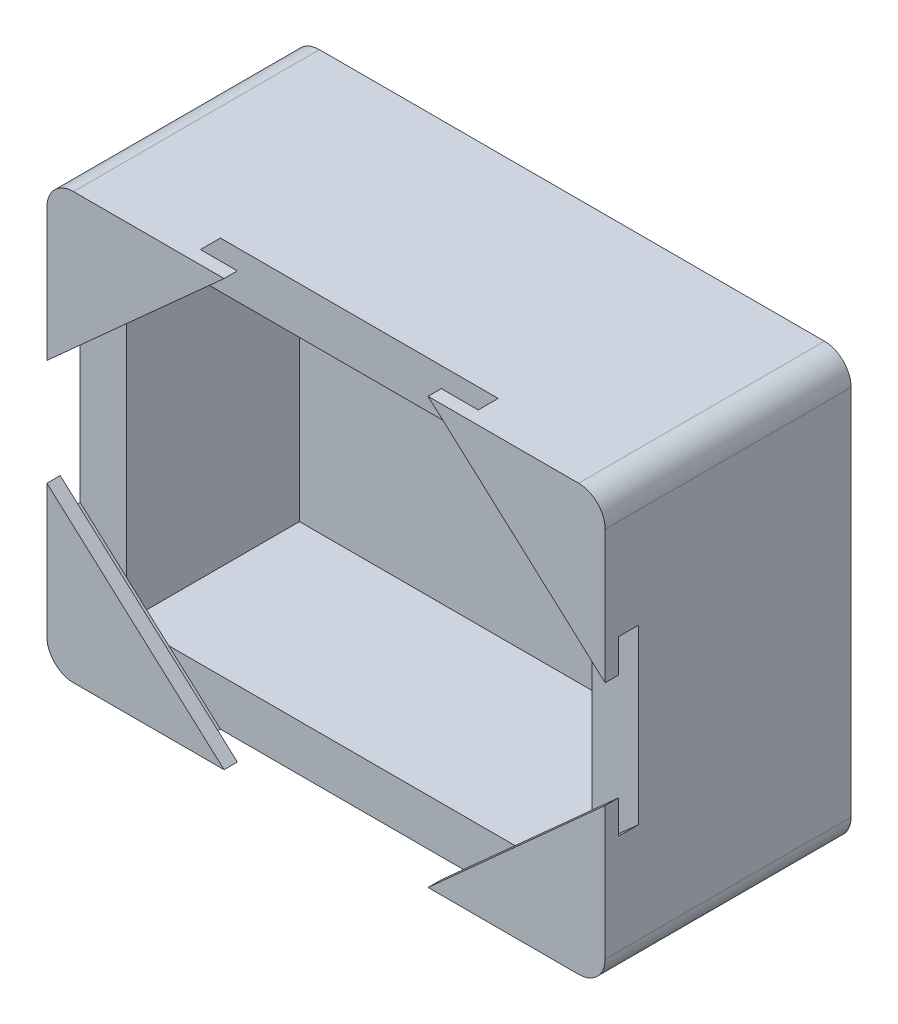
ISO-10303-21;
HEADER;
FILE_DESCRIPTION(('STEP AP214'),'2;1');
FILE_NAME('part.step','',(''),(''),'','','');
FILE_SCHEMA(('AUTOMOTIVE_DESIGN { 1 0 10303 214 1 1 1 1 }'));
ENDSEC;
DATA;
#1=APPLICATION_CONTEXT('core data for automotive mechanical design processes');
#2=APPLICATION_PROTOCOL_DEFINITION('international standard','automotive_design',2000,#1);
#3=PRODUCT_CONTEXT('',#1,'mechanical');
#4=PRODUCT('Part','Part','',(#3));
#5=PRODUCT_RELATED_PRODUCT_CATEGORY('part','',(#4));
#6=PRODUCT_DEFINITION_FORMATION('','',#4);
#7=PRODUCT_DEFINITION_CONTEXT('part definition',#1,'design');
#8=PRODUCT_DEFINITION('design','',#6,#7);
#9=PRODUCT_DEFINITION_SHAPE('','',#8);
#10=(LENGTH_UNIT() NAMED_UNIT(*) SI_UNIT(.MILLI.,.METRE.));
#11=(NAMED_UNIT(*) PLANE_ANGLE_UNIT() SI_UNIT($,.RADIAN.));
#12=(NAMED_UNIT(*) SI_UNIT($,.STERADIAN.) SOLID_ANGLE_UNIT());
#13=UNCERTAINTY_MEASURE_WITH_UNIT(LENGTH_MEASURE(1.E-05),#10,'distance_accuracy_value','');
#14=(GEOMETRIC_REPRESENTATION_CONTEXT(3) GLOBAL_UNCERTAINTY_ASSIGNED_CONTEXT((#13)) GLOBAL_UNIT_ASSIGNED_CONTEXT((#10,
#11,#12)) REPRESENTATION_CONTEXT('',''));
#15=CARTESIAN_POINT('',(0.,0.,0.));
#16=DIRECTION('',(0.,0.,1.));
#17=DIRECTION('',(1.,0.,0.));
#18=AXIS2_PLACEMENT_3D('',#15,#16,#17);
#19=CARTESIAN_POINT('',(2.1,0.650000000000005,1.65));
#20=DIRECTION('',(0.669130606358858,0.743144825477395,0.));
#21=DIRECTION('',(-0.743144825477395,0.669130606358858,0.));
#22=AXIS2_PLACEMENT_3D('',#19,#20,#21);
#23=PLANE('',#22);
#24=DIRECTION('',(0.,0.,-1.));
#25=VECTOR('',#24,1.);
#26=CARTESIAN_POINT('',(2.1,0.650000000000005,0.05));
#27=LINE('',#26,#25);
#28=CARTESIAN_POINT('',(2.1,0.650000000000005,1.8));
#29=VERTEX_POINT('',#28);
#30=CARTESIAN_POINT('',(2.1,0.650000000000005,1.65));
#31=VERTEX_POINT('',#30);
#32=EDGE_CURVE('E100',#29,#31,#27,.T.);
#33=ORIENTED_EDGE('',*,*,#32,.F.);
#34=DIRECTION('',(-0.743144825477395,0.669130606358858,0.));
#35=VECTOR('',#34,1.);
#36=CARTESIAN_POINT('',(2.1,0.650000000000005,1.8));
#37=LINE('',#36,#35);
#38=CARTESIAN_POINT('',(1.04491811091227,1.6,1.8));
#39=VERTEX_POINT('',#38);
#40=EDGE_CURVE('E205',#29,#39,#37,.T.);
#41=ORIENTED_EDGE('',*,*,#40,.T.);
#42=DIRECTION('',(0.,0.,1.));
#43=VECTOR('',#42,1.);
#44=CARTESIAN_POINT('',(1.04491811091227,1.6,0.05));
#45=LINE('',#44,#43);
#46=CARTESIAN_POINT('',(1.04491811091227,1.6,1.65));
#47=VERTEX_POINT('',#46);
#48=EDGE_CURVE('E211',#47,#39,#45,.T.);
#49=ORIENTED_EDGE('',*,*,#48,.F.);
#50=DIRECTION('',(-0.743144825477397,0.669130606358855,0.));
#51=VECTOR('',#50,1.);
#52=CARTESIAN_POINT('',(1.43363249110249,1.25,1.65));
#53=LINE('',#52,#51);
#54=CARTESIAN_POINT('',(1.43363249110249,1.25,1.65));
#55=VERTEX_POINT('',#54);
#56=EDGE_CURVE('E231',#55,#47,#53,.T.);
#57=ORIENTED_EDGE('',*,*,#56,.F.);
#58=DIRECTION('',(0.743144825477392,-0.669130606358861,0.));
#59=VECTOR('',#58,1.);
#60=CARTESIAN_POINT('',(1.43363249110249,1.25,1.65));
#61=LINE('',#60,#59);
#62=CARTESIAN_POINT('',(1.75,0.965141415504248,1.65));
#63=VERTEX_POINT('',#62);
#64=EDGE_CURVE('E247',#55,#63,#61,.T.);
#65=ORIENTED_EDGE('',*,*,#64,.T.);
#66=DIRECTION('',(-0.743144825477396,0.669130606358856,0.));
#67=VECTOR('',#66,1.);
#68=CARTESIAN_POINT('',(2.1,0.650000000000005,1.65));
#69=LINE('',#68,#67);
#70=EDGE_CURVE('E269',#31,#63,#69,.T.);
#71=ORIENTED_EDGE('',*,*,#70,.F.);
#72=EDGE_LOOP('',(#33,#41,#49,#57,#65,#71));
#73=FACE_BOUND('',#72,.T.);
#74=ADVANCED_FACE('F17',(#73),#23,.F.);
#75=CARTESIAN_POINT('',(0.,0.,1.8));
#76=DIRECTION('',(0.,0.,1.));
#77=DIRECTION('',(1.,0.,0.));
#78=AXIS2_PLACEMENT_3D('',#75,#76,#77);
#79=PLANE('',#78);
#80=DIRECTION('',(0.,1.,0.));
#81=VECTOR('',#80,1.);
#82=CARTESIAN_POINT('',(2.1,-1.6,1.8));
#83=LINE('',#82,#81);
#84=CARTESIAN_POINT('',(2.1,0.400000000000003,1.8));
#85=VERTEX_POINT('',#84);
#86=EDGE_CURVE('E286',#85,#29,#83,.T.);
#87=ORIENTED_EDGE('',*,*,#86,.F.);
#88=DIRECTION('',(0.743144825477394,-0.669130606358858,0.));
#89=VECTOR('',#88,1.);
#90=CARTESIAN_POINT('',(0.767264982204967,1.6,1.8));
#91=LINE('',#90,#89);
#92=CARTESIAN_POINT('',(0.767264982204967,1.6,1.8));
#93=VERTEX_POINT('',#92);
#94=EDGE_CURVE('E183',#93,#85,#91,.T.);
#95=ORIENTED_EDGE('',*,*,#94,.F.);
#96=DIRECTION('',(1.,0.,0.));
#97=VECTOR('',#96,1.);
#98=CARTESIAN_POINT('',(2.1,1.6,1.8));
#99=LINE('',#98,#97);
#100=EDGE_CURVE('E199',#39,#93,#99,.F.);
#101=ORIENTED_EDGE('',*,*,#100,.F.);
#102=ORIENTED_EDGE('',*,*,#40,.F.);
#103=EDGE_LOOP('',(#87,#95,#101,#102));
#104=FACE_BOUND('',#103,.T.);
#105=ADVANCED_FACE('F613',(#104),#79,.F.);
#106=CARTESIAN_POINT('',(0.767264982204967,1.6,1.65));
#107=DIRECTION('',(-0.669130606358858,-0.743144825477394,0.));
#108=DIRECTION('',(0.743144825477394,-0.669130606358858,0.));
#109=AXIS2_PLACEMENT_3D('',#106,#107,#108);
#110=PLANE('',#109);
#111=DIRECTION('',(0.743144825477396,-0.669130606358856,0.));
#112=VECTOR('',#111,1.);
#113=CARTESIAN_POINT('',(0.767264982204967,1.6,1.9));
#114=LINE('',#113,#112);
#115=CARTESIAN_POINT('',(0.767264982204967,1.6,1.9));
#116=VERTEX_POINT('',#115);
#117=CARTESIAN_POINT('',(2.1,0.400000000000004,1.9));
#118=VERTEX_POINT('',#117);
#119=EDGE_CURVE('E124',#116,#118,#114,.T.);
#120=ORIENTED_EDGE('',*,*,#119,.F.);
#121=DIRECTION('',(0.,0.,1.));
#122=VECTOR('',#121,1.);
#123=CARTESIAN_POINT('',(0.767264982204967,1.6,0.05));
#124=LINE('',#123,#122);
#125=EDGE_CURVE('E194',#93,#116,#124,.T.);
#126=ORIENTED_EDGE('',*,*,#125,.F.);
#127=ORIENTED_EDGE('',*,*,#94,.T.);
#128=DIRECTION('',(0.,0.,-1.));
#129=VECTOR('',#128,1.);
#130=CARTESIAN_POINT('',(2.1,0.400000000000004,0.05));
#131=LINE('',#130,#129);
#132=EDGE_CURVE('E186',#118,#85,#131,.T.);
#133=ORIENTED_EDGE('',*,*,#132,.F.);
#134=EDGE_LOOP('',(#120,#126,#127,#133));
#135=FACE_BOUND('',#134,.T.);
#136=ADVANCED_FACE('F617',(#135),#110,.T.);
#137=CARTESIAN_POINT('',(1.43363249110248,1.,1.9));
#138=DIRECTION('',(0.,0.,1.));
#139=DIRECTION('',(1.,0.,0.));
#140=AXIS2_PLACEMENT_3D('',#137,#138,#139);
#141=PLANE('',#140);
#142=CARTESIAN_POINT('',(1.9,1.4,1.9));
#143=DIRECTION('',(0.,0.,1.));
#144=DIRECTION('',(1.,0.,0.));
#145=AXIS2_PLACEMENT_3D('',#142,#143,#144);
#146=CIRCLE('',#145,0.2);
#147=CARTESIAN_POINT('',(1.9,1.6,1.9));
#148=VERTEX_POINT('',#147);
#149=CARTESIAN_POINT('',(2.1,1.4,1.9));
#150=VERTEX_POINT('',#149);
#151=EDGE_CURVE('E295',#148,#150,#146,.F.);
#152=ORIENTED_EDGE('',*,*,#151,.F.);
#153=DIRECTION('',(1.,0.,0.));
#154=VECTOR('',#153,1.);
#155=CARTESIAN_POINT('',(2.1,1.6,1.9));
#156=LINE('',#155,#154);
#157=EDGE_CURVE('E198',#116,#148,#156,.T.);
#158=ORIENTED_EDGE('',*,*,#157,.F.);
#159=ORIENTED_EDGE('',*,*,#119,.T.);
#160=DIRECTION('',(0.,1.,0.));
#161=VECTOR('',#160,1.);
#162=CARTESIAN_POINT('',(2.1,-1.6,1.9));
#163=LINE('',#162,#161);
#164=EDGE_CURVE('E191',#150,#118,#163,.F.);
#165=ORIENTED_EDGE('',*,*,#164,.F.);
#166=EDGE_LOOP('',(#152,#158,#159,#165));
#167=FACE_BOUND('',#166,.T.);
#168=ADVANCED_FACE('F620',(#167),#141,.T.);
#169=CARTESIAN_POINT('',(1.43363249110248,-0.999999999999995,1.9));
#170=DIRECTION('',(0.,0.,1.));
#171=DIRECTION('',(1.,0.,0.));
#172=AXIS2_PLACEMENT_3D('',#169,#170,#171);
#173=PLANE('',#172);
#174=CARTESIAN_POINT('',(1.9,-1.4,1.9));
#175=DIRECTION('',(0.,0.,1.));
#176=DIRECTION('',(1.,0.,0.));
#177=AXIS2_PLACEMENT_3D('',#174,#175,#176);
#178=CIRCLE('',#177,0.2);
#179=CARTESIAN_POINT('',(1.9,-1.6,1.9));
#180=VERTEX_POINT('',#179);
#181=CARTESIAN_POINT('',(2.1,-1.4,1.9));
#182=VERTEX_POINT('',#181);
#183=EDGE_CURVE('E20',#180,#182,#178,.T.);
#184=ORIENTED_EDGE('',*,*,#183,.T.);
#185=DIRECTION('',(0.,1.,0.));
#186=VECTOR('',#185,1.);
#187=CARTESIAN_POINT('',(2.1,-0.999999999999995,1.9));
#188=LINE('',#187,#186);
#189=CARTESIAN_POINT('',(2.1,-0.399999999999995,1.9));
#190=VERTEX_POINT('',#189);
#191=EDGE_CURVE('E88',#182,#190,#188,.T.);
#192=ORIENTED_EDGE('',*,*,#191,.T.);
#193=DIRECTION('',(-0.743144825477394,-0.669130606358858,0.));
#194=VECTOR('',#193,1.);
#195=CARTESIAN_POINT('',(2.1,-0.399999999999995,1.9));
#196=LINE('',#195,#194);
#197=CARTESIAN_POINT('',(0.767264982204965,-1.6,1.9));
#198=VERTEX_POINT('',#197);
#199=EDGE_CURVE('E164',#198,#190,#196,.F.);
#200=ORIENTED_EDGE('',*,*,#199,.F.);
#201=DIRECTION('',(1.,0.,0.));
#202=VECTOR('',#201,1.);
#203=CARTESIAN_POINT('',(1.43363249110248,-1.6,1.9));
#204=LINE('',#203,#202);
#205=EDGE_CURVE('E80',#198,#180,#204,.T.);
#206=ORIENTED_EDGE('',*,*,#205,.T.);
#207=EDGE_LOOP('',(#184,#192,#200,#206));
#208=FACE_BOUND('',#207,.T.);
#209=ADVANCED_FACE('F85',(#208),#173,.T.);
#210=CARTESIAN_POINT('',(-1.43363249110248,1.,1.9));
#211=DIRECTION('',(0.,0.,1.));
#212=DIRECTION('',(1.,0.,0.));
#213=AXIS2_PLACEMENT_3D('',#210,#211,#212);
#214=PLANE('',#213);
#215=DIRECTION('',(0.743144825477394,0.669130606358858,0.));
#216=VECTOR('',#215,1.);
#217=CARTESIAN_POINT('',(-2.1,0.400000000000004,1.9));
#218=LINE('',#217,#216);
#219=CARTESIAN_POINT('',(-0.767264982204968,1.6,1.9));
#220=VERTEX_POINT('',#219);
#221=CARTESIAN_POINT('',(-2.1,0.400000000000004,1.9));
#222=VERTEX_POINT('',#221);
#223=EDGE_CURVE('E151',#220,#222,#218,.F.);
#224=ORIENTED_EDGE('',*,*,#223,.F.);
#225=DIRECTION('',(1.,0.,0.));
#226=VECTOR('',#225,1.);
#227=CARTESIAN_POINT('',(-1.43363249110248,1.6,1.9));
#228=LINE('',#227,#226);
#229=CARTESIAN_POINT('',(-1.9,1.6,1.9));
#230=VERTEX_POINT('',#229);
#231=EDGE_CURVE('E319',#220,#230,#228,.F.);
#232=ORIENTED_EDGE('',*,*,#231,.T.);
#233=CARTESIAN_POINT('',(-1.9,1.4,1.9));
#234=DIRECTION('',(0.,0.,1.));
#235=DIRECTION('',(1.,0.,0.));
#236=AXIS2_PLACEMENT_3D('',#233,#234,#235);
#237=CIRCLE('',#236,0.2);
#238=CARTESIAN_POINT('',(-2.1,1.4,1.9));
#239=VERTEX_POINT('',#238);
#240=EDGE_CURVE('E109',#230,#239,#237,.T.);
#241=ORIENTED_EDGE('',*,*,#240,.T.);
#242=DIRECTION('',(0.,1.,0.));
#243=VECTOR('',#242,1.);
#244=CARTESIAN_POINT('',(-2.1,1.,1.9));
#245=LINE('',#244,#243);
#246=EDGE_CURVE('E115',#239,#222,#245,.F.);
#247=ORIENTED_EDGE('',*,*,#246,.T.);
#248=EDGE_LOOP('',(#224,#232,#241,#247));
#249=FACE_BOUND('',#248,.T.);
#250=ADVANCED_FACE('F339',(#249),#214,.T.);
#251=CARTESIAN_POINT('',(-1.43363249110248,-0.999999999999995,1.9));
#252=DIRECTION('',(0.,0.,1.));
#253=DIRECTION('',(1.,0.,0.));
#254=AXIS2_PLACEMENT_3D('',#251,#252,#253);
#255=PLANE('',#254);
#256=CARTESIAN_POINT('',(-1.9,-1.4,1.9));
#257=DIRECTION('',(0.,0.,1.));
#258=DIRECTION('',(1.,0.,0.));
#259=AXIS2_PLACEMENT_3D('',#256,#257,#258);
#260=CIRCLE('',#259,0.2);
#261=CARTESIAN_POINT('',(-2.1,-1.4,1.9));
#262=VERTEX_POINT('',#261);
#263=CARTESIAN_POINT('',(-1.9,-1.6,1.9));
#264=VERTEX_POINT('',#263);
#265=EDGE_CURVE('E309',#262,#264,#260,.T.);
#266=ORIENTED_EDGE('',*,*,#265,.T.);
#267=DIRECTION('',(1.,0.,0.));
#268=VECTOR('',#267,1.);
#269=CARTESIAN_POINT('',(-1.43363249110248,-1.6,1.9));
#270=LINE('',#269,#268);
#271=CARTESIAN_POINT('',(-0.767264982204967,-1.6,1.9));
#272=VERTEX_POINT('',#271);
#273=EDGE_CURVE('E177',#264,#272,#270,.T.);
#274=ORIENTED_EDGE('',*,*,#273,.T.);
#275=DIRECTION('',(-0.743144825477395,0.669130606358858,0.));
#276=VECTOR('',#275,1.);
#277=CARTESIAN_POINT('',(-0.767264982204967,-1.6,1.9));
#278=LINE('',#277,#276);
#279=CARTESIAN_POINT('',(-2.1,-0.399999999999998,1.9));
#280=VERTEX_POINT('',#279);
#281=EDGE_CURVE('E127',#280,#272,#278,.F.);
#282=ORIENTED_EDGE('',*,*,#281,.F.);
#283=DIRECTION('',(0.,1.,0.));
#284=VECTOR('',#283,1.);
#285=CARTESIAN_POINT('',(-2.1,-0.999999999999995,1.9));
#286=LINE('',#285,#284);
#287=EDGE_CURVE('E311',#280,#262,#286,.F.);
#288=ORIENTED_EDGE('',*,*,#287,.T.);
#289=EDGE_LOOP('',(#266,#274,#282,#288));
#290=FACE_BOUND('',#289,.T.);
#291=ADVANCED_FACE('F778',(#290),#255,.T.);
#292=CARTESIAN_POINT('',(2.1,-0.399999999999995,1.65));
#293=DIRECTION('',(-0.669130606358858,0.743144825477394,0.));
#294=DIRECTION('',(-0.743144825477394,-0.669130606358858,0.));
#295=AXIS2_PLACEMENT_3D('',#292,#293,#294);
#296=PLANE('',#295);
#297=ORIENTED_EDGE('',*,*,#199,.T.);
#298=DIRECTION('',(0.,0.,1.));
#299=VECTOR('',#298,1.);
#300=CARTESIAN_POINT('',(2.1,-0.399999999999995,1.65));
#301=LINE('',#300,#299);
#302=CARTESIAN_POINT('',(2.1,-0.399999999999995,1.8));
#303=VERTEX_POINT('',#302);
#304=EDGE_CURVE('E107',#190,#303,#301,.F.);
#305=ORIENTED_EDGE('',*,*,#304,.T.);
#306=DIRECTION('',(-0.743144825477394,-0.669130606358859,0.));
#307=VECTOR('',#306,1.);
#308=CARTESIAN_POINT('',(2.1,-0.399999999999995,1.8));
#309=LINE('',#308,#307);
#310=CARTESIAN_POINT('',(0.767264982204966,-1.6,1.8));
#311=VERTEX_POINT('',#310);
#312=EDGE_CURVE('E380',#303,#311,#309,.T.);
#313=ORIENTED_EDGE('',*,*,#312,.T.);
#314=DIRECTION('',(0.,0.,1.));
#315=VECTOR('',#314,1.);
#316=CARTESIAN_POINT('',(0.767264982204965,-1.6,1.65));
#317=LINE('',#316,#315);
#318=EDGE_CURVE('E167',#311,#198,#317,.T.);
#319=ORIENTED_EDGE('',*,*,#318,.T.);
#320=EDGE_LOOP('',(#297,#305,#313,#319));
#321=FACE_BOUND('',#320,.T.);
#322=ADVANCED_FACE('F780',(#321),#296,.T.);
#323=CARTESIAN_POINT('',(-2.1,0.400000000000004,1.65));
#324=DIRECTION('',(0.669130606358858,-0.743144825477394,0.));
#325=DIRECTION('',(0.743144825477394,0.669130606358858,0.));
#326=AXIS2_PLACEMENT_3D('',#323,#324,#325);
#327=PLANE('',#326);
#328=ORIENTED_EDGE('',*,*,#223,.T.);
#329=DIRECTION('',(0.,0.,1.));
#330=VECTOR('',#329,1.);
#331=CARTESIAN_POINT('',(-2.1,0.400000000000004,1.65));
#332=LINE('',#331,#330);
#333=CARTESIAN_POINT('',(-2.1,0.400000000000004,1.8));
#334=VERTEX_POINT('',#333);
#335=EDGE_CURVE('E144',#222,#334,#332,.F.);
#336=ORIENTED_EDGE('',*,*,#335,.T.);
#337=DIRECTION('',(0.743144825477395,0.669130606358857,0.));
#338=VECTOR('',#337,1.);
#339=CARTESIAN_POINT('',(-2.1,0.400000000000004,1.8));
#340=LINE('',#339,#338);
#341=CARTESIAN_POINT('',(-0.767264982204968,1.6,1.8));
#342=VERTEX_POINT('',#341);
#343=EDGE_CURVE('E371',#334,#342,#340,.T.);
#344=ORIENTED_EDGE('',*,*,#343,.T.);
#345=DIRECTION('',(0.,0.,1.));
#346=VECTOR('',#345,1.);
#347=CARTESIAN_POINT('',(-0.767264982204969,1.6,1.65));
#348=LINE('',#347,#346);
#349=EDGE_CURVE('E147',#342,#220,#348,.T.);
#350=ORIENTED_EDGE('',*,*,#349,.T.);
#351=EDGE_LOOP('',(#328,#336,#344,#350));
#352=FACE_BOUND('',#351,.T.);
#353=ADVANCED_FACE('F349',(#352),#327,.T.);
#354=CARTESIAN_POINT('',(-0.767264982204967,-1.6,1.65));
#355=DIRECTION('',(0.669130606358858,0.743144825477395,0.));
#356=DIRECTION('',(-0.743144825477395,0.669130606358858,0.));
#357=AXIS2_PLACEMENT_3D('',#354,#355,#356);
#358=PLANE('',#357);
#359=ORIENTED_EDGE('',*,*,#281,.T.);
#360=DIRECTION('',(0.,0.,1.));
#361=VECTOR('',#360,1.);
#362=CARTESIAN_POINT('',(-0.767264982204967,-1.6,1.65));
#363=LINE('',#362,#361);
#364=CARTESIAN_POINT('',(-0.767264982204967,-1.6,1.8));
#365=VERTEX_POINT('',#364);
#366=EDGE_CURVE('E131',#272,#365,#363,.F.);
#367=ORIENTED_EDGE('',*,*,#366,.T.);
#368=DIRECTION('',(-0.743144825477394,0.669130606358859,0.));
#369=VECTOR('',#368,1.);
#370=CARTESIAN_POINT('',(-0.767264982204967,-1.6,1.8));
#371=LINE('',#370,#369);
#372=CARTESIAN_POINT('',(-2.1,-0.399999999999998,1.8));
#373=VERTEX_POINT('',#372);
#374=EDGE_CURVE('E433',#365,#373,#371,.T.);
#375=ORIENTED_EDGE('',*,*,#374,.T.);
#376=DIRECTION('',(0.,0.,1.));
#377=VECTOR('',#376,1.);
#378=CARTESIAN_POINT('',(-2.1,-0.399999999999999,1.65));
#379=LINE('',#378,#377);
#380=EDGE_CURVE('E132',#373,#280,#379,.T.);
#381=ORIENTED_EDGE('',*,*,#380,.T.);
#382=EDGE_LOOP('',(#359,#367,#375,#381));
#383=FACE_BOUND('',#382,.T.);
#384=ADVANCED_FACE('F774',(#383),#358,.T.);
#385=CARTESIAN_POINT('',(0.,0.,1.8));
#386=DIRECTION('',(0.,0.,1.));
#387=DIRECTION('',(1.,0.,0.));
#388=AXIS2_PLACEMENT_3D('',#385,#386,#387);
#389=PLANE('',#388);
#390=DIRECTION('',(1.,0.,0.));
#391=VECTOR('',#390,1.);
#392=CARTESIAN_POINT('',(0.,-1.6,1.8));
#393=LINE('',#392,#391);
#394=CARTESIAN_POINT('',(1.04491811091227,-1.6,1.8));
#395=VERTEX_POINT('',#394);
#396=EDGE_CURVE('E372',#311,#395,#393,.T.);
#397=ORIENTED_EDGE('',*,*,#396,.F.);
#398=ORIENTED_EDGE('',*,*,#312,.F.);
#399=DIRECTION('',(0.,1.,0.));
#400=VECTOR('',#399,1.);
#401=CARTESIAN_POINT('',(2.1,0.,1.8));
#402=LINE('',#401,#400);
#403=CARTESIAN_POINT('',(2.1,-0.649999999999999,1.8));
#404=VERTEX_POINT('',#403);
#405=EDGE_CURVE('E138',#404,#303,#402,.T.);
#406=ORIENTED_EDGE('',*,*,#405,.F.);
#407=DIRECTION('',(0.743144825477394,0.669130606358858,0.));
#408=VECTOR('',#407,1.);
#409=CARTESIAN_POINT('',(1.04491811091227,-1.6,1.8));
#410=LINE('',#409,#408);
#411=EDGE_CURVE('E405',#404,#395,#410,.F.);
#412=ORIENTED_EDGE('',*,*,#411,.T.);
#413=EDGE_LOOP('',(#397,#398,#406,#412));
#414=FACE_BOUND('',#413,.T.);
#415=ADVANCED_FACE('F403',(#414),#389,.F.);
#416=CARTESIAN_POINT('',(0.,0.,1.8));
#417=DIRECTION('',(0.,0.,1.));
#418=DIRECTION('',(1.,0.,0.));
#419=AXIS2_PLACEMENT_3D('',#416,#417,#418);
#420=PLANE('',#419);
#421=DIRECTION('',(1.,0.,0.));
#422=VECTOR('',#421,1.);
#423=CARTESIAN_POINT('',(0.,1.6,1.8));
#424=LINE('',#423,#422);
#425=CARTESIAN_POINT('',(-1.04491811091227,1.6,1.8));
#426=VERTEX_POINT('',#425);
#427=EDGE_CURVE('E376',#342,#426,#424,.F.);
#428=ORIENTED_EDGE('',*,*,#427,.F.);
#429=ORIENTED_EDGE('',*,*,#343,.F.);
#430=DIRECTION('',(0.,1.,0.));
#431=VECTOR('',#430,1.);
#432=CARTESIAN_POINT('',(-2.1,0.,1.8));
#433=LINE('',#432,#431);
#434=CARTESIAN_POINT('',(-2.1,0.650000000000004,1.8));
#435=VERTEX_POINT('',#434);
#436=EDGE_CURVE('E359',#435,#334,#433,.F.);
#437=ORIENTED_EDGE('',*,*,#436,.F.);
#438=DIRECTION('',(-0.743144825477394,-0.669130606358858,0.));
#439=VECTOR('',#438,1.);
#440=CARTESIAN_POINT('',(-1.04491811091227,1.6,1.8));
#441=LINE('',#440,#439);
#442=EDGE_CURVE('E455',#435,#426,#441,.F.);
#443=ORIENTED_EDGE('',*,*,#442,.T.);
#444=EDGE_LOOP('',(#428,#429,#437,#443));
#445=FACE_BOUND('',#444,.T.);
#446=ADVANCED_FACE('F462',(#445),#420,.F.);
#447=CARTESIAN_POINT('',(0.,0.,1.8));
#448=DIRECTION('',(0.,0.,1.));
#449=DIRECTION('',(1.,0.,0.));
#450=AXIS2_PLACEMENT_3D('',#447,#448,#449);
#451=PLANE('',#450);
#452=DIRECTION('',(0.,1.,0.));
#453=VECTOR('',#452,1.);
#454=CARTESIAN_POINT('',(-2.1,0.,1.8));
#455=LINE('',#454,#453);
#456=CARTESIAN_POINT('',(-2.1,-0.649999999999995,1.8));
#457=VERTEX_POINT('',#456);
#458=EDGE_CURVE('E429',#373,#457,#455,.F.);
#459=ORIENTED_EDGE('',*,*,#458,.F.);
#460=ORIENTED_EDGE('',*,*,#374,.F.);
#461=DIRECTION('',(1.,0.,0.));
#462=VECTOR('',#461,1.);
#463=CARTESIAN_POINT('',(0.,-1.6,1.8));
#464=LINE('',#463,#462);
#465=CARTESIAN_POINT('',(-1.04491811091226,-1.6,1.8));
#466=VERTEX_POINT('',#465);
#467=EDGE_CURVE('E437',#466,#365,#464,.T.);
#468=ORIENTED_EDGE('',*,*,#467,.F.);
#469=DIRECTION('',(0.743144825477395,-0.669130606358858,0.));
#470=VECTOR('',#469,1.);
#471=CARTESIAN_POINT('',(-2.1,-0.649999999999995,1.8));
#472=LINE('',#471,#470);
#473=EDGE_CURVE('E594',#466,#457,#472,.F.);
#474=ORIENTED_EDGE('',*,*,#473,.T.);
#475=EDGE_LOOP('',(#459,#460,#468,#474));
#476=FACE_BOUND('',#475,.T.);
#477=ADVANCED_FACE('F697',(#476),#451,.F.);
#478=CARTESIAN_POINT('',(1.04491811091227,-1.6,1.65));
#479=DIRECTION('',(0.669130606358858,-0.743144825477394,0.));
#480=DIRECTION('',(0.743144825477394,0.669130606358858,0.));
#481=AXIS2_PLACEMENT_3D('',#478,#479,#480);
#482=PLANE('',#481);
#483=DIRECTION('',(0.,0.,1.));
#484=VECTOR('',#483,1.);
#485=CARTESIAN_POINT('',(1.04491811091227,-1.6,1.65));
#486=LINE('',#485,#484);
#487=CARTESIAN_POINT('',(1.04491811091227,-1.6,1.65));
#488=VERTEX_POINT('',#487);
#489=EDGE_CURVE('E416',#395,#488,#486,.F.);
#490=ORIENTED_EDGE('',*,*,#489,.F.);
#491=ORIENTED_EDGE('',*,*,#411,.F.);
#492=DIRECTION('',(0.,0.,1.));
#493=VECTOR('',#492,1.);
#494=CARTESIAN_POINT('',(2.1,-0.65,1.65));
#495=LINE('',#494,#493);
#496=CARTESIAN_POINT('',(2.1,-0.649999999999999,1.65));
#497=VERTEX_POINT('',#496);
#498=EDGE_CURVE('E395',#497,#404,#495,.T.);
#499=ORIENTED_EDGE('',*,*,#498,.F.);
#500=DIRECTION('',(0.743144825477394,0.669130606358858,0.));
#501=VECTOR('',#500,1.);
#502=CARTESIAN_POINT('',(1.75,-0.965141415504243,1.65));
#503=LINE('',#502,#501);
#504=CARTESIAN_POINT('',(1.75,-0.965141415504244,1.65));
#505=VERTEX_POINT('',#504);
#506=EDGE_CURVE('E292',#505,#497,#503,.T.);
#507=ORIENTED_EDGE('',*,*,#506,.F.);
#508=DIRECTION('',(0.743144825477394,0.669130606358858,0.));
#509=VECTOR('',#508,1.);
#510=CARTESIAN_POINT('',(1.04491811091227,-1.6,1.65));
#511=LINE('',#510,#509);
#512=CARTESIAN_POINT('',(1.43363249110248,-1.25,1.65));
#513=VERTEX_POINT('',#512);
#514=EDGE_CURVE('E422',#513,#505,#511,.T.);
#515=ORIENTED_EDGE('',*,*,#514,.F.);
#516=DIRECTION('',(0.743144825477394,0.669130606358858,0.));
#517=VECTOR('',#516,1.);
#518=CARTESIAN_POINT('',(1.04491811091227,-1.6,1.65));
#519=LINE('',#518,#517);
#520=EDGE_CURVE('E420',#488,#513,#519,.T.);
#521=ORIENTED_EDGE('',*,*,#520,.F.);
#522=EDGE_LOOP('',(#490,#491,#499,#507,#515,#521));
#523=FACE_BOUND('',#522,.T.);
#524=ADVANCED_FACE('F410',(#523),#482,.F.);
#525=CARTESIAN_POINT('',(-1.04491811091227,1.6,1.65));
#526=DIRECTION('',(-0.669130606358858,0.743144825477394,0.));
#527=DIRECTION('',(-0.743144825477394,-0.669130606358858,0.));
#528=AXIS2_PLACEMENT_3D('',#525,#526,#527);
#529=PLANE('',#528);
#530=DIRECTION('',(0.,0.,1.));
#531=VECTOR('',#530,1.);
#532=CARTESIAN_POINT('',(-1.04491811091227,1.6,1.65));
#533=LINE('',#532,#531);
#534=CARTESIAN_POINT('',(-1.04491811091227,1.6,1.65));
#535=VERTEX_POINT('',#534);
#536=EDGE_CURVE('E450',#426,#535,#533,.F.);
#537=ORIENTED_EDGE('',*,*,#536,.F.);
#538=ORIENTED_EDGE('',*,*,#442,.F.);
#539=DIRECTION('',(0.,0.,1.));
#540=VECTOR('',#539,1.);
#541=CARTESIAN_POINT('',(-2.1,0.650000000000003,1.65));
#542=LINE('',#541,#540);
#543=CARTESIAN_POINT('',(-2.1,0.650000000000004,1.65));
#544=VERTEX_POINT('',#543);
#545=EDGE_CURVE('E363',#544,#435,#542,.T.);
#546=ORIENTED_EDGE('',*,*,#545,.F.);
#547=DIRECTION('',(-0.743144825477394,-0.669130606358858,0.));
#548=VECTOR('',#547,1.);
#549=CARTESIAN_POINT('',(-1.75,0.965141415504247,1.65));
#550=LINE('',#549,#548);
#551=CARTESIAN_POINT('',(-1.75,0.965141415504247,1.65));
#552=VERTEX_POINT('',#551);
#553=EDGE_CURVE('E273',#552,#544,#550,.T.);
#554=ORIENTED_EDGE('',*,*,#553,.F.);
#555=DIRECTION('',(-0.743144825477394,-0.669130606358858,0.));
#556=VECTOR('',#555,1.);
#557=CARTESIAN_POINT('',(-1.04491811091227,1.6,1.65));
#558=LINE('',#557,#556);
#559=CARTESIAN_POINT('',(-1.43363249110249,1.25,1.65));
#560=VERTEX_POINT('',#559);
#561=EDGE_CURVE('E466',#560,#552,#558,.T.);
#562=ORIENTED_EDGE('',*,*,#561,.F.);
#563=DIRECTION('',(-0.743144825477394,-0.669130606358858,0.));
#564=VECTOR('',#563,1.);
#565=CARTESIAN_POINT('',(-1.04491811091227,1.6,1.65));
#566=LINE('',#565,#564);
#567=EDGE_CURVE('E458',#535,#560,#566,.T.);
#568=ORIENTED_EDGE('',*,*,#567,.F.);
#569=EDGE_LOOP('',(#537,#538,#546,#554,#562,#568));
#570=FACE_BOUND('',#569,.T.);
#571=ADVANCED_FACE('F454',(#570),#529,.F.);
#572=CARTESIAN_POINT('',(-2.1,-0.649999999999995,1.65));
#573=DIRECTION('',(-0.669130606358858,-0.743144825477395,0.));
#574=DIRECTION('',(0.743144825477395,-0.669130606358858,0.));
#575=AXIS2_PLACEMENT_3D('',#572,#573,#574);
#576=PLANE('',#575);
#577=DIRECTION('',(0.,0.,1.));
#578=VECTOR('',#577,1.);
#579=CARTESIAN_POINT('',(-2.1,-0.649999999999995,1.65));
#580=LINE('',#579,#578);
#581=CARTESIAN_POINT('',(-2.1,-0.649999999999995,1.65));
#582=VERTEX_POINT('',#581);
#583=EDGE_CURVE('E691',#457,#582,#580,.F.);
#584=ORIENTED_EDGE('',*,*,#583,.F.);
#585=ORIENTED_EDGE('',*,*,#473,.F.);
#586=DIRECTION('',(0.,0.,1.));
#587=VECTOR('',#586,1.);
#588=CARTESIAN_POINT('',(-1.04491811091226,-1.6,1.65));
#589=LINE('',#588,#587);
#590=CARTESIAN_POINT('',(-1.04491811091226,-1.6,1.65));
#591=VERTEX_POINT('',#590);
#592=EDGE_CURVE('E591',#591,#466,#589,.T.);
#593=ORIENTED_EDGE('',*,*,#592,.F.);
#594=DIRECTION('',(0.743144825477395,-0.669130606358858,0.));
#595=VECTOR('',#594,1.);
#596=CARTESIAN_POINT('',(-2.1,-0.649999999999995,1.65));
#597=LINE('',#596,#595);
#598=CARTESIAN_POINT('',(-1.43363249110248,-1.25,1.65));
#599=VERTEX_POINT('',#598);
#600=EDGE_CURVE('E582',#599,#591,#597,.T.);
#601=ORIENTED_EDGE('',*,*,#600,.F.);
#602=DIRECTION('',(0.743144825477395,-0.669130606358858,0.));
#603=VECTOR('',#602,1.);
#604=CARTESIAN_POINT('',(-2.1,-0.649999999999995,1.65));
#605=LINE('',#604,#603);
#606=CARTESIAN_POINT('',(-1.75,-0.965141415504238,1.65));
#607=VERTEX_POINT('',#606);
#608=EDGE_CURVE('E587',#607,#599,#605,.T.);
#609=ORIENTED_EDGE('',*,*,#608,.F.);
#610=DIRECTION('',(0.743144825477394,-0.669130606358858,0.));
#611=VECTOR('',#610,1.);
#612=CARTESIAN_POINT('',(-2.1,-0.649999999999995,1.65));
#613=LINE('',#612,#611);
#614=EDGE_CURVE('E266',#582,#607,#613,.T.);
#615=ORIENTED_EDGE('',*,*,#614,.F.);
#616=EDGE_LOOP('',(#584,#585,#593,#601,#609,#615));
#617=FACE_BOUND('',#616,.T.);
#618=ADVANCED_FACE('F584',(#617),#576,.F.);
#619=CARTESIAN_POINT('',(0.,0.,1.65));
#620=DIRECTION('',(0.,0.,1.));
#621=DIRECTION('',(1.,0.,0.));
#622=AXIS2_PLACEMENT_3D('',#619,#620,#621);
#623=PLANE('',#622);
#624=DIRECTION('',(0.,1.,0.));
#625=VECTOR('',#624,1.);
#626=CARTESIAN_POINT('',(2.1,0.,1.65));
#627=LINE('',#626,#625);
#628=EDGE_CURVE('E274',#497,#31,#627,.T.);
#629=ORIENTED_EDGE('',*,*,#628,.T.);
#630=ORIENTED_EDGE('',*,*,#70,.T.);
#631=DIRECTION('',(0.,1.,0.));
#632=VECTOR('',#631,1.);
#633=CARTESIAN_POINT('',(1.75,1.25,1.65));
#634=LINE('',#633,#632);
#635=EDGE_CURVE('E261',#63,#505,#634,.F.);
#636=ORIENTED_EDGE('',*,*,#635,.T.);
#637=ORIENTED_EDGE('',*,*,#506,.T.);
#638=EDGE_LOOP('',(#629,#630,#636,#637));
#639=FACE_BOUND('',#638,.T.);
#640=ADVANCED_FACE('F739',(#639),#623,.T.);
#641=CARTESIAN_POINT('',(0.,0.,1.65));
#642=DIRECTION('',(0.,0.,1.));
#643=DIRECTION('',(1.,0.,0.));
#644=AXIS2_PLACEMENT_3D('',#641,#642,#643);
#645=PLANE('',#644);
#646=DIRECTION('',(0.,1.,0.));
#647=VECTOR('',#646,1.);
#648=CARTESIAN_POINT('',(-2.1,0.,1.65));
#649=LINE('',#648,#647);
#650=EDGE_CURVE('E683',#544,#582,#649,.F.);
#651=ORIENTED_EDGE('',*,*,#650,.T.);
#652=ORIENTED_EDGE('',*,*,#614,.T.);
#653=DIRECTION('',(0.,1.,0.));
#654=VECTOR('',#653,1.);
#655=CARTESIAN_POINT('',(-1.75,-1.25,1.65));
#656=LINE('',#655,#654);
#657=EDGE_CURVE('E668',#607,#552,#656,.T.);
#658=ORIENTED_EDGE('',*,*,#657,.T.);
#659=ORIENTED_EDGE('',*,*,#553,.T.);
#660=EDGE_LOOP('',(#651,#652,#658,#659));
#661=FACE_BOUND('',#660,.T.);
#662=ADVANCED_FACE('F771',(#661),#645,.T.);
#663=CARTESIAN_POINT('',(1.75,1.25,1.65));
#664=DIRECTION('',(1.,0.,0.));
#665=DIRECTION('',(0.,0.,-1.));
#666=AXIS2_PLACEMENT_3D('',#663,#664,#665);
#667=PLANE('',#666);
#668=DIRECTION('',(0.,0.,-1.));
#669=VECTOR('',#668,1.);
#670=CARTESIAN_POINT('',(1.75,1.25,1.65));
#671=LINE('',#670,#669);
#672=CARTESIAN_POINT('',(1.75,1.25,0.35));
#673=VERTEX_POINT('',#672);
#674=CARTESIAN_POINT('',(1.75,1.25,1.65));
#675=VERTEX_POINT('',#674);
#676=EDGE_CURVE('E672',#673,#675,#671,.F.);
#677=ORIENTED_EDGE('',*,*,#676,.F.);
#678=DIRECTION('',(0.,1.,0.));
#679=VECTOR('',#678,1.);
#680=CARTESIAN_POINT('',(1.75,0.,0.35));
#681=LINE('',#680,#679);
#682=CARTESIAN_POINT('',(1.75,-1.25,0.35));
#683=VERTEX_POINT('',#682);
#684=EDGE_CURVE('E654',#673,#683,#681,.F.);
#685=ORIENTED_EDGE('',*,*,#684,.T.);
#686=DIRECTION('',(0.,0.,-1.));
#687=VECTOR('',#686,1.);
#688=CARTESIAN_POINT('',(1.75,-1.25,1.65));
#689=LINE('',#688,#687);
#690=CARTESIAN_POINT('',(1.75,-1.25,1.65));
#691=VERTEX_POINT('',#690);
#692=EDGE_CURVE('E675',#691,#683,#689,.T.);
#693=ORIENTED_EDGE('',*,*,#692,.F.);
#694=DIRECTION('',(0.,1.,0.));
#695=VECTOR('',#694,1.);
#696=CARTESIAN_POINT('',(1.75,1.25,1.65));
#697=LINE('',#696,#695);
#698=EDGE_CURVE('E265',#505,#691,#697,.F.);
#699=ORIENTED_EDGE('',*,*,#698,.F.);
#700=ORIENTED_EDGE('',*,*,#635,.F.);
#701=DIRECTION('',(0.,1.,0.));
#702=VECTOR('',#701,1.);
#703=CARTESIAN_POINT('',(1.75,0.,1.65));
#704=LINE('',#703,#702);
#705=EDGE_CURVE('E251',#63,#675,#704,.T.);
#706=ORIENTED_EDGE('',*,*,#705,.T.);
#707=EDGE_LOOP('',(#677,#685,#693,#699,#700,#706));
#708=FACE_BOUND('',#707,.T.);
#709=ADVANCED_FACE('F751',(#708),#667,.F.);
#710=CARTESIAN_POINT('',(-1.75,-1.25,1.65));
#711=DIRECTION('',(-1.,0.,0.));
#712=DIRECTION('',(0.,0.,1.));
#713=AXIS2_PLACEMENT_3D('',#710,#711,#712);
#714=PLANE('',#713);
#715=DIRECTION('',(0.,0.,1.));
#716=VECTOR('',#715,1.);
#717=CARTESIAN_POINT('',(-1.75,-1.25,1.65));
#718=LINE('',#717,#716);
#719=CARTESIAN_POINT('',(-1.75,-1.25,0.35));
#720=VERTEX_POINT('',#719);
#721=CARTESIAN_POINT('',(-1.75,-1.25,1.65));
#722=VERTEX_POINT('',#721);
#723=EDGE_CURVE('E252',#720,#722,#718,.T.);
#724=ORIENTED_EDGE('',*,*,#723,.F.);
#725=DIRECTION('',(0.,1.,0.));
#726=VECTOR('',#725,1.);
#727=CARTESIAN_POINT('',(-1.75,0.,0.35));
#728=LINE('',#727,#726);
#729=CARTESIAN_POINT('',(-1.75,1.25,0.35));
#730=VERTEX_POINT('',#729);
#731=EDGE_CURVE('E244',#720,#730,#728,.T.);
#732=ORIENTED_EDGE('',*,*,#731,.T.);
#733=DIRECTION('',(0.,0.,1.));
#734=VECTOR('',#733,1.);
#735=CARTESIAN_POINT('',(-1.75,1.25,1.65));
#736=LINE('',#735,#734);
#737=CARTESIAN_POINT('',(-1.75,1.25,1.65));
#738=VERTEX_POINT('',#737);
#739=EDGE_CURVE('E665',#738,#730,#736,.F.);
#740=ORIENTED_EDGE('',*,*,#739,.F.);
#741=DIRECTION('',(0.,1.,0.));
#742=VECTOR('',#741,1.);
#743=CARTESIAN_POINT('',(-1.75,0.,1.65));
#744=LINE('',#743,#742);
#745=EDGE_CURVE('E280',#738,#552,#744,.F.);
#746=ORIENTED_EDGE('',*,*,#745,.T.);
#747=ORIENTED_EDGE('',*,*,#657,.F.);
#748=DIRECTION('',(0.,1.,0.));
#749=VECTOR('',#748,1.);
#750=CARTESIAN_POINT('',(-1.75,0.,1.65));
#751=LINE('',#750,#749);
#752=EDGE_CURVE('E657',#607,#722,#751,.F.);
#753=ORIENTED_EDGE('',*,*,#752,.T.);
#754=EDGE_LOOP('',(#724,#732,#740,#746,#747,#753));
#755=FACE_BOUND('',#754,.T.);
#756=ADVANCED_FACE('F767',(#755),#714,.F.);
#757=CARTESIAN_POINT('',(0.,0.,1.65));
#758=DIRECTION('',(0.,0.,1.));
#759=DIRECTION('',(1.,0.,0.));
#760=AXIS2_PLACEMENT_3D('',#757,#758,#759);
#761=PLANE('',#760);
#762=ORIENTED_EDGE('',*,*,#64,.F.);
#763=DIRECTION('',(1.,0.,0.));
#764=VECTOR('',#763,1.);
#765=CARTESIAN_POINT('',(-1.75,1.25,1.65));
#766=LINE('',#765,#764);
#767=EDGE_CURVE('E239',#55,#675,#766,.T.);
#768=ORIENTED_EDGE('',*,*,#767,.T.);
#769=ORIENTED_EDGE('',*,*,#705,.F.);
#770=EDGE_LOOP('',(#762,#768,#769));
#771=FACE_BOUND('',#770,.T.);
#772=ADVANCED_FACE('F744',(#771),#761,.F.);
#773=CARTESIAN_POINT('',(0.,0.,1.65));
#774=DIRECTION('',(0.,0.,1.));
#775=DIRECTION('',(1.,0.,0.));
#776=AXIS2_PLACEMENT_3D('',#773,#774,#775);
#777=PLANE('',#776);
#778=ORIENTED_EDGE('',*,*,#561,.T.);
#779=ORIENTED_EDGE('',*,*,#745,.F.);
#780=DIRECTION('',(1.,0.,0.));
#781=VECTOR('',#780,1.);
#782=CARTESIAN_POINT('',(-1.75,1.25,1.65));
#783=LINE('',#782,#781);
#784=EDGE_CURVE('E644',#738,#560,#783,.T.);
#785=ORIENTED_EDGE('',*,*,#784,.T.);
#786=EDGE_LOOP('',(#778,#779,#785));
#787=FACE_BOUND('',#786,.T.);
#788=ADVANCED_FACE('F831',(#787),#777,.F.);
#789=CARTESIAN_POINT('',(0.,0.,1.65));
#790=DIRECTION('',(0.,0.,1.));
#791=DIRECTION('',(1.,0.,0.));
#792=AXIS2_PLACEMENT_3D('',#789,#790,#791);
#793=PLANE('',#792);
#794=ORIENTED_EDGE('',*,*,#608,.T.);
#795=DIRECTION('',(1.,0.,0.));
#796=VECTOR('',#795,1.);
#797=CARTESIAN_POINT('',(1.75,-1.25,1.65));
#798=LINE('',#797,#796);
#799=EDGE_CURVE('E640',#599,#722,#798,.F.);
#800=ORIENTED_EDGE('',*,*,#799,.T.);
#801=ORIENTED_EDGE('',*,*,#752,.F.);
#802=EDGE_LOOP('',(#794,#800,#801));
#803=FACE_BOUND('',#802,.T.);
#804=ADVANCED_FACE('F764',(#803),#793,.F.);
#805=CARTESIAN_POINT('',(0.,0.,0.35));
#806=DIRECTION('',(0.,0.,-1.));
#807=DIRECTION('',(-1.,0.,0.));
#808=AXIS2_PLACEMENT_3D('',#805,#806,#807);
#809=PLANE('',#808);
#810=DIRECTION('',(1.,0.,0.));
#811=VECTOR('',#810,1.);
#812=CARTESIAN_POINT('',(1.75,-1.25,0.35));
#813=LINE('',#812,#811);
#814=EDGE_CURVE('E636',#720,#683,#813,.T.);
#815=ORIENTED_EDGE('',*,*,#814,.T.);
#816=ORIENTED_EDGE('',*,*,#684,.F.);
#817=DIRECTION('',(1.,0.,0.));
#818=VECTOR('',#817,1.);
#819=CARTESIAN_POINT('',(-1.75,1.25,0.35));
#820=LINE('',#819,#818);
#821=EDGE_CURVE('E243',#673,#730,#820,.F.);
#822=ORIENTED_EDGE('',*,*,#821,.T.);
#823=ORIENTED_EDGE('',*,*,#731,.F.);
#824=EDGE_LOOP('',(#815,#816,#822,#823));
#825=FACE_BOUND('',#824,.T.);
#826=ADVANCED_FACE('F825',(#825),#809,.F.);
#827=CARTESIAN_POINT('',(0.,0.,1.65));
#828=DIRECTION('',(0.,0.,1.));
#829=DIRECTION('',(1.,0.,0.));
#830=AXIS2_PLACEMENT_3D('',#827,#828,#829);
#831=PLANE('',#830);
#832=ORIENTED_EDGE('',*,*,#514,.T.);
#833=ORIENTED_EDGE('',*,*,#698,.T.);
#834=DIRECTION('',(1.,0.,0.));
#835=VECTOR('',#834,1.);
#836=CARTESIAN_POINT('',(1.75,-1.25,1.65));
#837=LINE('',#836,#835);
#838=EDGE_CURVE('E258',#691,#513,#837,.F.);
#839=ORIENTED_EDGE('',*,*,#838,.T.);
#840=EDGE_LOOP('',(#832,#833,#839));
#841=FACE_BOUND('',#840,.T.);
#842=ADVANCED_FACE('F755',(#841),#831,.F.);
#843=CARTESIAN_POINT('',(-1.75,1.25,1.65));
#844=DIRECTION('',(0.,1.,0.));
#845=DIRECTION('',(0.,0.,1.));
#846=AXIS2_PLACEMENT_3D('',#843,#844,#845);
#847=PLANE('',#846);
#848=ORIENTED_EDGE('',*,*,#739,.T.);
#849=ORIENTED_EDGE('',*,*,#821,.F.);
#850=ORIENTED_EDGE('',*,*,#676,.T.);
#851=ORIENTED_EDGE('',*,*,#767,.F.);
#852=DIRECTION('',(1.,0.,0.));
#853=VECTOR('',#852,1.);
#854=CARTESIAN_POINT('',(0.,1.25,1.65));
#855=LINE('',#854,#853);
#856=EDGE_CURVE('E236',#560,#55,#855,.T.);
#857=ORIENTED_EDGE('',*,*,#856,.F.);
#858=ORIENTED_EDGE('',*,*,#784,.F.);
#859=EDGE_LOOP('',(#848,#849,#850,#851,#857,#858));
#860=FACE_BOUND('',#859,.T.);
#861=ADVANCED_FACE('F746',(#860),#847,.F.);
#862=CARTESIAN_POINT('',(1.75,-1.25,1.65));
#863=DIRECTION('',(0.,-1.,0.));
#864=DIRECTION('',(0.,0.,-1.));
#865=AXIS2_PLACEMENT_3D('',#862,#863,#864);
#866=PLANE('',#865);
#867=ORIENTED_EDGE('',*,*,#692,.T.);
#868=ORIENTED_EDGE('',*,*,#814,.F.);
#869=ORIENTED_EDGE('',*,*,#723,.T.);
#870=ORIENTED_EDGE('',*,*,#799,.F.);
#871=DIRECTION('',(1.,0.,0.));
#872=VECTOR('',#871,1.);
#873=CARTESIAN_POINT('',(0.,-1.25,1.65));
#874=LINE('',#873,#872);
#875=EDGE_CURVE('E306',#513,#599,#874,.F.);
#876=ORIENTED_EDGE('',*,*,#875,.F.);
#877=ORIENTED_EDGE('',*,*,#838,.F.);
#878=EDGE_LOOP('',(#867,#868,#869,#870,#876,#877));
#879=FACE_BOUND('',#878,.T.);
#880=ADVANCED_FACE('F757',(#879),#866,.F.);
#881=CARTESIAN_POINT('',(0.,0.,1.65));
#882=DIRECTION('',(0.,0.,1.));
#883=DIRECTION('',(1.,0.,0.));
#884=AXIS2_PLACEMENT_3D('',#881,#882,#883);
#885=PLANE('',#884);
#886=DIRECTION('',(1.,0.,0.));
#887=VECTOR('',#886,1.);
#888=CARTESIAN_POINT('',(2.1,1.6,1.65));
#889=LINE('',#888,#887);
#890=EDGE_CURVE('E222',#535,#47,#889,.T.);
#891=ORIENTED_EDGE('',*,*,#890,.F.);
#892=ORIENTED_EDGE('',*,*,#567,.T.);
#893=ORIENTED_EDGE('',*,*,#856,.T.);
#894=ORIENTED_EDGE('',*,*,#56,.T.);
#895=EDGE_LOOP('',(#891,#892,#893,#894));
#896=FACE_BOUND('',#895,.T.);
#897=ADVANCED_FACE('F601',(#896),#885,.T.);
#898=CARTESIAN_POINT('',(-1.9,1.4,0.05));
#899=DIRECTION('',(0.,0.,1.));
#900=DIRECTION('',(1.,0.,0.));
#901=AXIS2_PLACEMENT_3D('',#898,#899,#900);
#902=CYLINDRICAL_SURFACE('',#901,0.2);
#903=DIRECTION('',(0.,0.,1.));
#904=VECTOR('',#903,1.);
#905=CARTESIAN_POINT('',(-2.1,1.4,0.05));
#906=LINE('',#905,#904);
#907=CARTESIAN_POINT('',(-2.1,1.4,0.05));
#908=VERTEX_POINT('',#907);
#909=EDGE_CURVE('E704',#239,#908,#906,.F.);
#910=ORIENTED_EDGE('',*,*,#909,.F.);
#911=ORIENTED_EDGE('',*,*,#240,.F.);
#912=DIRECTION('',(0.,0.,1.));
#913=VECTOR('',#912,1.);
#914=CARTESIAN_POINT('',(-1.9,1.6,0.05));
#915=LINE('',#914,#913);
#916=CARTESIAN_POINT('',(-1.9,1.6,0.05));
#917=VERTEX_POINT('',#916);
#918=EDGE_CURVE('E228',#917,#230,#915,.T.);
#919=ORIENTED_EDGE('',*,*,#918,.F.);
#920=CARTESIAN_POINT('',(-1.9,1.4,0.05));
#921=DIRECTION('',(0.,0.,1.));
#922=DIRECTION('',(1.,0.,0.));
#923=AXIS2_PLACEMENT_3D('',#920,#921,#922);
#924=CIRCLE('',#923,0.2);
#925=EDGE_CURVE('E235',#917,#908,#924,.T.);
#926=ORIENTED_EDGE('',*,*,#925,.T.);
#927=EDGE_LOOP('',(#910,#911,#919,#926));
#928=FACE_BOUND('',#927,.T.);
#929=ADVANCED_FACE('F813',(#928),#902,.T.);
#930=CARTESIAN_POINT('',(0.,0.,1.65));
#931=DIRECTION('',(0.,0.,1.));
#932=DIRECTION('',(1.,0.,0.));
#933=AXIS2_PLACEMENT_3D('',#930,#931,#932);
#934=PLANE('',#933);
#935=DIRECTION('',(1.,0.,0.));
#936=VECTOR('',#935,1.);
#937=CARTESIAN_POINT('',(-2.1,-1.6,1.65));
#938=LINE('',#937,#936);
#939=EDGE_CURVE('E486',#488,#591,#938,.F.);
#940=ORIENTED_EDGE('',*,*,#939,.F.);
#941=ORIENTED_EDGE('',*,*,#520,.T.);
#942=ORIENTED_EDGE('',*,*,#875,.T.);
#943=ORIENTED_EDGE('',*,*,#600,.T.);
#944=EDGE_LOOP('',(#940,#941,#942,#943));
#945=FACE_BOUND('',#944,.T.);
#946=ADVANCED_FACE('F479',(#945),#934,.T.);
#947=CARTESIAN_POINT('',(-1.9,-1.4,0.05));
#948=DIRECTION('',(0.,0.,1.));
#949=DIRECTION('',(1.,0.,0.));
#950=AXIS2_PLACEMENT_3D('',#947,#948,#949);
#951=CYLINDRICAL_SURFACE('',#950,0.2);
#952=DIRECTION('',(0.,0.,-1.));
#953=VECTOR('',#952,1.);
#954=CARTESIAN_POINT('',(-1.9,-1.6,0.05));
#955=LINE('',#954,#953);
#956=CARTESIAN_POINT('',(-1.9,-1.6,0.05));
#957=VERTEX_POINT('',#956);
#958=EDGE_CURVE('E703',#264,#957,#955,.T.);
#959=ORIENTED_EDGE('',*,*,#958,.F.);
#960=ORIENTED_EDGE('',*,*,#265,.F.);
#961=DIRECTION('',(0.,0.,1.));
#962=VECTOR('',#961,1.);
#963=CARTESIAN_POINT('',(-2.1,-1.4,0.05));
#964=LINE('',#963,#962);
#965=CARTESIAN_POINT('',(-2.1,-1.4,0.05));
#966=VERTEX_POINT('',#965);
#967=EDGE_CURVE('E626',#966,#262,#964,.T.);
#968=ORIENTED_EDGE('',*,*,#967,.F.);
#969=CARTESIAN_POINT('',(-1.9,-1.4,0.05));
#970=DIRECTION('',(0.,0.,1.));
#971=DIRECTION('',(1.,0.,0.));
#972=AXIS2_PLACEMENT_3D('',#969,#970,#971);
#973=CIRCLE('',#972,0.2);
#974=EDGE_CURVE('E303',#966,#957,#973,.T.);
#975=ORIENTED_EDGE('',*,*,#974,.T.);
#976=EDGE_LOOP('',(#959,#960,#968,#975));
#977=FACE_BOUND('',#976,.T.);
#978=ADVANCED_FACE('F807',(#977),#951,.T.);
#979=CARTESIAN_POINT('',(1.9,-1.4,0.05));
#980=DIRECTION('',(0.,0.,1.));
#981=DIRECTION('',(1.,0.,0.));
#982=AXIS2_PLACEMENT_3D('',#979,#980,#981);
#983=CYLINDRICAL_SURFACE('',#982,0.2);
#984=DIRECTION('',(0.,0.,-1.));
#985=VECTOR('',#984,1.);
#986=CARTESIAN_POINT('',(2.1,-1.4,0.05));
#987=LINE('',#986,#985);
#988=CARTESIAN_POINT('',(2.1,-1.4,0.05));
#989=VERTEX_POINT('',#988);
#990=EDGE_CURVE('E94',#182,#989,#987,.T.);
#991=ORIENTED_EDGE('',*,*,#990,.F.);
#992=ORIENTED_EDGE('',*,*,#183,.F.);
#993=DIRECTION('',(0.,0.,-1.));
#994=VECTOR('',#993,1.);
#995=CARTESIAN_POINT('',(1.9,-1.6,0.05));
#996=LINE('',#995,#994);
#997=CARTESIAN_POINT('',(1.9,-1.6,0.05));
#998=VERTEX_POINT('',#997);
#999=EDGE_CURVE('E708',#998,#180,#996,.F.);
#1000=ORIENTED_EDGE('',*,*,#999,.F.);
#1001=CARTESIAN_POINT('',(1.9,-1.4,0.05));
#1002=DIRECTION('',(0.,0.,1.));
#1003=DIRECTION('',(1.,0.,0.));
#1004=AXIS2_PLACEMENT_3D('',#1001,#1002,#1003);
#1005=CIRCLE('',#1004,0.2);
#1006=EDGE_CURVE('E96',#998,#989,#1005,.T.);
#1007=ORIENTED_EDGE('',*,*,#1006,.T.);
#1008=EDGE_LOOP('',(#991,#992,#1000,#1007));
#1009=FACE_BOUND('',#1008,.T.);
#1010=ADVANCED_FACE('F95',(#1009),#983,.T.);
#1011=CARTESIAN_POINT('',(1.9,1.4,0.05));
#1012=DIRECTION('',(0.,0.,1.));
#1013=DIRECTION('',(1.,0.,0.));
#1014=AXIS2_PLACEMENT_3D('',#1011,#1012,#1013);
#1015=CYLINDRICAL_SURFACE('',#1014,0.2);
#1016=DIRECTION('',(0.,0.,1.));
#1017=VECTOR('',#1016,1.);
#1018=CARTESIAN_POINT('',(1.9,1.6,0.05));
#1019=LINE('',#1018,#1017);
#1020=CARTESIAN_POINT('',(1.9,1.6,0.05));
#1021=VERTEX_POINT('',#1020);
#1022=EDGE_CURVE('E622',#148,#1021,#1019,.F.);
#1023=ORIENTED_EDGE('',*,*,#1022,.F.);
#1024=ORIENTED_EDGE('',*,*,#151,.T.);
#1025=DIRECTION('',(0.,0.,-1.));
#1026=VECTOR('',#1025,1.);
#1027=CARTESIAN_POINT('',(2.1,1.4,0.05));
#1028=LINE('',#1027,#1026);
#1029=CARTESIAN_POINT('',(2.1,1.4,0.05));
#1030=VERTEX_POINT('',#1029);
#1031=EDGE_CURVE('E99',#1030,#150,#1028,.F.);
#1032=ORIENTED_EDGE('',*,*,#1031,.F.);
#1033=CARTESIAN_POINT('',(1.9,1.4,0.05));
#1034=DIRECTION('',(0.,0.,1.));
#1035=DIRECTION('',(1.,0.,0.));
#1036=AXIS2_PLACEMENT_3D('',#1033,#1034,#1035);
#1037=CIRCLE('',#1036,0.2);
#1038=EDGE_CURVE('E36',#1030,#1021,#1037,.T.);
#1039=ORIENTED_EDGE('',*,*,#1038,.T.);
#1040=EDGE_LOOP('',(#1023,#1024,#1032,#1039));
#1041=FACE_BOUND('',#1040,.T.);
#1042=ADVANCED_FACE('F725',(#1041),#1015,.T.);
#1043=CARTESIAN_POINT('',(2.1,1.6,0.05));
#1044=DIRECTION('',(0.,1.,0.));
#1045=DIRECTION('',(0.,0.,1.));
#1046=AXIS2_PLACEMENT_3D('',#1043,#1044,#1045);
#1047=PLANE('',#1046);
#1048=ORIENTED_EDGE('',*,*,#157,.T.);
#1049=ORIENTED_EDGE('',*,*,#1022,.T.);
#1050=DIRECTION('',(1.,0.,0.));
#1051=VECTOR('',#1050,1.);
#1052=CARTESIAN_POINT('',(0.,1.6,0.05));
#1053=LINE('',#1052,#1051);
#1054=EDGE_CURVE('E190',#1021,#917,#1053,.F.);
#1055=ORIENTED_EDGE('',*,*,#1054,.T.);
#1056=ORIENTED_EDGE('',*,*,#918,.T.);
#1057=ORIENTED_EDGE('',*,*,#231,.F.);
#1058=ORIENTED_EDGE('',*,*,#349,.F.);
#1059=ORIENTED_EDGE('',*,*,#427,.T.);
#1060=ORIENTED_EDGE('',*,*,#536,.T.);
#1061=ORIENTED_EDGE('',*,*,#890,.T.);
#1062=ORIENTED_EDGE('',*,*,#48,.T.);
#1063=ORIENTED_EDGE('',*,*,#100,.T.);
#1064=ORIENTED_EDGE('',*,*,#125,.T.);
#1065=EDGE_LOOP('',(#1048,#1049,#1055,#1056,#1057,#1058,#1059,#1060,#1061,#1062,#1063,#1064));
#1066=FACE_BOUND('',#1065,.T.);
#1067=ADVANCED_FACE('F448',(#1066),#1047,.T.);
#1068=CARTESIAN_POINT('',(-2.1,1.6,0.05));
#1069=DIRECTION('',(-1.,0.,0.));
#1070=DIRECTION('',(0.,0.,1.));
#1071=AXIS2_PLACEMENT_3D('',#1068,#1069,#1070);
#1072=PLANE('',#1071);
#1073=ORIENTED_EDGE('',*,*,#246,.F.);
#1074=ORIENTED_EDGE('',*,*,#909,.T.);
#1075=DIRECTION('',(0.,1.,0.));
#1076=VECTOR('',#1075,1.);
#1077=CARTESIAN_POINT('',(-2.1,0.,0.05));
#1078=LINE('',#1077,#1076);
#1079=EDGE_CURVE('E731',#908,#966,#1078,.F.);
#1080=ORIENTED_EDGE('',*,*,#1079,.T.);
#1081=ORIENTED_EDGE('',*,*,#967,.T.);
#1082=ORIENTED_EDGE('',*,*,#287,.F.);
#1083=ORIENTED_EDGE('',*,*,#380,.F.);
#1084=ORIENTED_EDGE('',*,*,#458,.T.);
#1085=ORIENTED_EDGE('',*,*,#583,.T.);
#1086=ORIENTED_EDGE('',*,*,#650,.F.);
#1087=ORIENTED_EDGE('',*,*,#545,.T.);
#1088=ORIENTED_EDGE('',*,*,#436,.T.);
#1089=ORIENTED_EDGE('',*,*,#335,.F.);
#1090=EDGE_LOOP('',(#1073,#1074,#1080,#1081,#1082,#1083,#1084,#1085,#1086,#1087,#1088,#1089));
#1091=FACE_BOUND('',#1090,.T.);
#1092=ADVANCED_FACE('F356',(#1091),#1072,.T.);
#1093=CARTESIAN_POINT('',(-2.1,-1.6,0.05));
#1094=DIRECTION('',(0.,-1.,0.));
#1095=DIRECTION('',(0.,0.,-1.));
#1096=AXIS2_PLACEMENT_3D('',#1093,#1094,#1095);
#1097=PLANE('',#1096);
#1098=ORIENTED_EDGE('',*,*,#205,.F.);
#1099=ORIENTED_EDGE('',*,*,#318,.F.);
#1100=ORIENTED_EDGE('',*,*,#396,.T.);
#1101=ORIENTED_EDGE('',*,*,#489,.T.);
#1102=ORIENTED_EDGE('',*,*,#939,.T.);
#1103=ORIENTED_EDGE('',*,*,#592,.T.);
#1104=ORIENTED_EDGE('',*,*,#467,.T.);
#1105=ORIENTED_EDGE('',*,*,#366,.F.);
#1106=ORIENTED_EDGE('',*,*,#273,.F.);
#1107=ORIENTED_EDGE('',*,*,#958,.T.);
#1108=DIRECTION('',(1.,0.,0.));
#1109=VECTOR('',#1108,1.);
#1110=CARTESIAN_POINT('',(0.,-1.6,0.05));
#1111=LINE('',#1110,#1109);
#1112=EDGE_CURVE('E27',#957,#998,#1111,.T.);
#1113=ORIENTED_EDGE('',*,*,#1112,.T.);
#1114=ORIENTED_EDGE('',*,*,#999,.T.);
#1115=EDGE_LOOP('',(#1098,#1099,#1100,#1101,#1102,#1103,#1104,#1105,#1106,#1107,#1113,#1114));
#1116=FACE_BOUND('',#1115,.T.);
#1117=ADVANCED_FACE('F700',(#1116),#1097,.T.);
#1118=CARTESIAN_POINT('',(2.1,-1.6,0.05));
#1119=DIRECTION('',(1.,0.,0.));
#1120=DIRECTION('',(0.,0.,-1.));
#1121=AXIS2_PLACEMENT_3D('',#1118,#1119,#1120);
#1122=PLANE('',#1121);
#1123=ORIENTED_EDGE('',*,*,#164,.T.);
#1124=ORIENTED_EDGE('',*,*,#132,.T.);
#1125=ORIENTED_EDGE('',*,*,#86,.T.);
#1126=ORIENTED_EDGE('',*,*,#32,.T.);
#1127=ORIENTED_EDGE('',*,*,#628,.F.);
#1128=ORIENTED_EDGE('',*,*,#498,.T.);
#1129=ORIENTED_EDGE('',*,*,#405,.T.);
#1130=ORIENTED_EDGE('',*,*,#304,.F.);
#1131=ORIENTED_EDGE('',*,*,#191,.F.);
#1132=ORIENTED_EDGE('',*,*,#990,.T.);
#1133=DIRECTION('',(0.,1.,0.));
#1134=VECTOR('',#1133,1.);
#1135=CARTESIAN_POINT('',(2.1,0.,0.05));
#1136=LINE('',#1135,#1134);
#1137=EDGE_CURVE('E11',#989,#1030,#1136,.T.);
#1138=ORIENTED_EDGE('',*,*,#1137,.T.);
#1139=ORIENTED_EDGE('',*,*,#1031,.T.);
#1140=EDGE_LOOP('',(#1123,#1124,#1125,#1126,#1127,#1128,#1129,#1130,#1131,#1132,#1138,#1139));
#1141=FACE_BOUND('',#1140,.T.);
#1142=ADVANCED_FACE('F104',(#1141),#1122,.T.);
#1143=CARTESIAN_POINT('',(0.,0.,0.05));
#1144=DIRECTION('',(0.,0.,1.));
#1145=DIRECTION('',(1.,0.,0.));
#1146=AXIS2_PLACEMENT_3D('',#1143,#1144,#1145);
#1147=PLANE('',#1146);
#1148=ORIENTED_EDGE('',*,*,#1137,.F.);
#1149=ORIENTED_EDGE('',*,*,#1006,.F.);
#1150=ORIENTED_EDGE('',*,*,#1112,.F.);
#1151=ORIENTED_EDGE('',*,*,#974,.F.);
#1152=ORIENTED_EDGE('',*,*,#1079,.F.);
#1153=ORIENTED_EDGE('',*,*,#925,.F.);
#1154=ORIENTED_EDGE('',*,*,#1054,.F.);
#1155=ORIENTED_EDGE('',*,*,#1038,.F.);
#1156=EDGE_LOOP('',(#1148,#1149,#1150,#1151,#1152,#1153,#1154,#1155));
#1157=FACE_BOUND('',#1156,.T.);
#1158=ADVANCED_FACE('F727',(#1157),#1147,.F.);
#1159=CLOSED_SHELL('',(#74,#105,#136,#168,#209,#250,#291,#322,#353,#384,#415,#446,#477,#524,
#571,#618,#640,#662,#709,#756,#772,#788,#804,#826,#842,#861,#880,#897,#929,#946,#978,#1010,
#1042,#1067,#1092,#1117,#1142,#1158));
#1160=MANIFOLD_SOLID_BREP('B1',#1159);
#1161=ADVANCED_BREP_SHAPE_REPRESENTATION('',(#18,#1160),#14);
#1162=SHAPE_DEFINITION_REPRESENTATION(#9,#1161);
ENDSEC;
END-ISO-10303-21;
